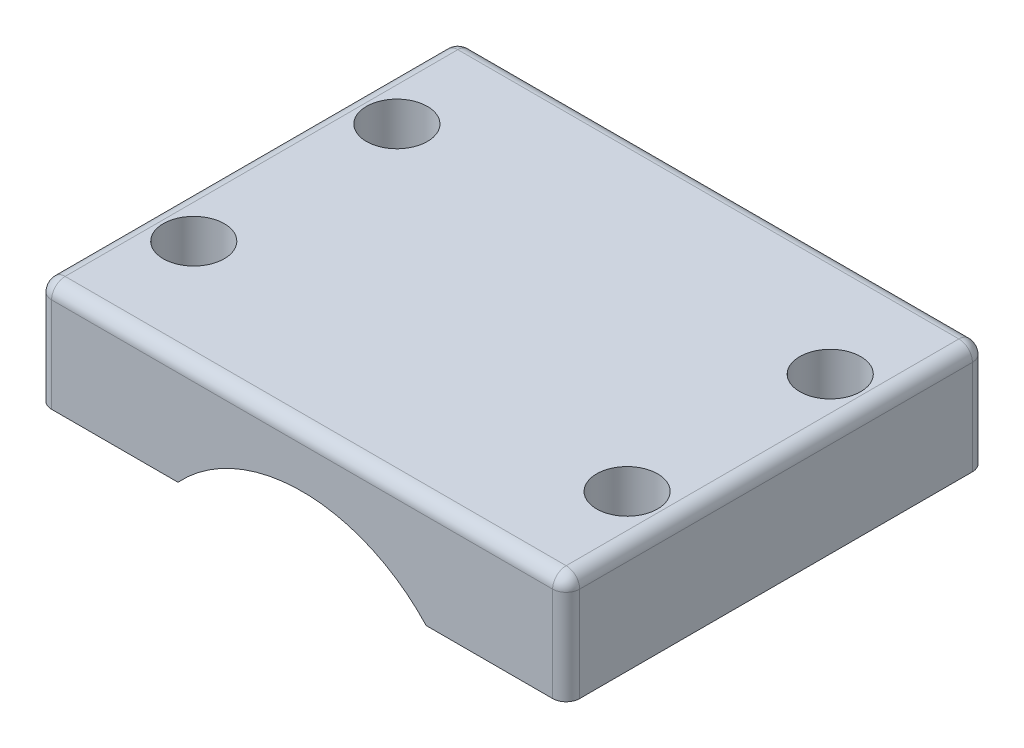
ISO-10303-21;
HEADER;
FILE_DESCRIPTION(('STEP AP214'),'2;1');
FILE_NAME('part.step','',(''),(''),'','','');
FILE_SCHEMA(('AUTOMOTIVE_DESIGN { 1 0 10303 214 1 1 1 1 }'));
ENDSEC;
DATA;
#1=APPLICATION_CONTEXT('core data for automotive mechanical design processes');
#2=APPLICATION_PROTOCOL_DEFINITION('international standard','automotive_design',2000,#1);
#3=PRODUCT_CONTEXT('',#1,'mechanical');
#4=PRODUCT('Part','Part','',(#3));
#5=PRODUCT_RELATED_PRODUCT_CATEGORY('part','',(#4));
#6=PRODUCT_DEFINITION_FORMATION('','',#4);
#7=PRODUCT_DEFINITION_CONTEXT('part definition',#1,'design');
#8=PRODUCT_DEFINITION('design','',#6,#7);
#9=PRODUCT_DEFINITION_SHAPE('','',#8);
#10=(LENGTH_UNIT() NAMED_UNIT(*) SI_UNIT(.MILLI.,.METRE.));
#11=(NAMED_UNIT(*) PLANE_ANGLE_UNIT() SI_UNIT($,.RADIAN.));
#12=(NAMED_UNIT(*) SI_UNIT($,.STERADIAN.) SOLID_ANGLE_UNIT());
#13=UNCERTAINTY_MEASURE_WITH_UNIT(LENGTH_MEASURE(1.E-05),#10,'distance_accuracy_value','');
#14=(GEOMETRIC_REPRESENTATION_CONTEXT(3) GLOBAL_UNCERTAINTY_ASSIGNED_CONTEXT((#13)) GLOBAL_UNIT_ASSIGNED_CONTEXT((#10,
#11,#12)) REPRESENTATION_CONTEXT('',''));
#15=CARTESIAN_POINT('',(0.,0.,0.));
#16=DIRECTION('',(0.,0.,1.));
#17=DIRECTION('',(1.,0.,0.));
#18=AXIS2_PLACEMENT_3D('',#15,#16,#17);
#19=CARTESIAN_POINT('',(0.,0.,0.));
#20=DIRECTION('',(0.,1.,0.));
#21=DIRECTION('',(0.,0.,1.));
#22=AXIS2_PLACEMENT_3D('',#19,#20,#21);
#23=PLANE('',#22);
#24=CARTESIAN_POINT('',(3.5,0.,-8.));
#25=DIRECTION('',(0.,1.,0.));
#26=DIRECTION('',(0.,0.,1.));
#27=AXIS2_PLACEMENT_3D('',#24,#25,#26);
#28=CIRCLE('',#27,2.25);
#29=CARTESIAN_POINT('',(3.5,0.,-5.75));
#30=VERTEX_POINT('',#29);
#31=EDGE_CURVE('E223',#30,#30,#28,.T.);
#32=ORIENTED_EDGE('',*,*,#31,.T.);
#33=EDGE_LOOP('',(#32));
#34=FACE_BOUND('',#33,.T.);
#35=CARTESIAN_POINT('',(3.5,0.,-23.));
#36=DIRECTION('',(0.,1.,0.));
#37=DIRECTION('',(0.,0.,-1.));
#38=AXIS2_PLACEMENT_3D('',#35,#36,#37);
#39=CIRCLE('',#38,2.25);
#40=CARTESIAN_POINT('',(3.5,0.,-25.25));
#41=VERTEX_POINT('',#40);
#42=EDGE_CURVE('E231',#41,#41,#39,.T.);
#43=ORIENTED_EDGE('',*,*,#42,.T.);
#44=EDGE_LOOP('',(#43));
#45=FACE_BOUND('',#44,.T.);
#46=DIRECTION('',(-1.,0.,0.));
#47=VECTOR('',#46,1.);
#48=CARTESIAN_POINT('',(0.,0.,-31.));
#49=LINE('',#48,#47);
#50=CARTESIAN_POINT('',(10.3348486100883,0.,-31.));
#51=VERTEX_POINT('',#50);
#52=CARTESIAN_POINT('',(1.,0.,-31.));
#53=VERTEX_POINT('',#52);
#54=EDGE_CURVE('E135',#51,#53,#49,.T.);
#55=ORIENTED_EDGE('',*,*,#54,.F.);
#56=DIRECTION('',(0.,0.,1.));
#57=VECTOR('',#56,1.);
#58=CARTESIAN_POINT('',(10.3348486100883,0.,-82.9230199429887));
#59=LINE('',#58,#57);
#60=CARTESIAN_POINT('',(10.3348486100883,0.,0.));
#61=VERTEX_POINT('',#60);
#62=EDGE_CURVE('E51',#51,#61,#59,.T.);
#63=ORIENTED_EDGE('',*,*,#62,.T.);
#64=DIRECTION('',(1.,0.,0.));
#65=VECTOR('',#64,1.);
#66=CARTESIAN_POINT('',(0.,0.,0.));
#67=LINE('',#66,#65);
#68=CARTESIAN_POINT('',(1.,0.,0.));
#69=VERTEX_POINT('',#68);
#70=EDGE_CURVE('E132',#69,#61,#67,.T.);
#71=ORIENTED_EDGE('',*,*,#70,.F.);
#72=CARTESIAN_POINT('',(1.,0.,-1.));
#73=DIRECTION('',(0.,1.,0.));
#74=DIRECTION('',(0.,0.,1.));
#75=AXIS2_PLACEMENT_3D('',#72,#73,#74);
#76=CIRCLE('',#75,1.);
#77=CARTESIAN_POINT('',(0.,0.,-1.));
#78=VERTEX_POINT('',#77);
#79=EDGE_CURVE('E11',#69,#78,#76,.F.);
#80=ORIENTED_EDGE('',*,*,#79,.T.);
#81=DIRECTION('',(0.,0.,1.));
#82=VECTOR('',#81,1.);
#83=CARTESIAN_POINT('',(0.,0.,-31.));
#84=LINE('',#83,#82);
#85=CARTESIAN_POINT('',(0.,0.,-30.));
#86=VERTEX_POINT('',#85);
#87=EDGE_CURVE('E144',#86,#78,#84,.T.);
#88=ORIENTED_EDGE('',*,*,#87,.F.);
#89=CARTESIAN_POINT('',(1.,0.,-30.));
#90=DIRECTION('',(0.,1.,0.));
#91=DIRECTION('',(0.,0.,1.));
#92=AXIS2_PLACEMENT_3D('',#89,#90,#91);
#93=CIRCLE('',#92,1.);
#94=EDGE_CURVE('E183',#86,#53,#93,.F.);
#95=ORIENTED_EDGE('',*,*,#94,.T.);
#96=EDGE_LOOP('',(#55,#63,#71,#80,#88,#95));
#97=FACE_BOUND('',#96,.T.);
#98=ADVANCED_FACE('F34',(#34,#45,#97),#23,.F.);
#99=CARTESIAN_POINT('',(0.,8.,0.));
#100=DIRECTION('',(0.,1.,0.));
#101=DIRECTION('',(0.,0.,1.));
#102=AXIS2_PLACEMENT_3D('',#99,#100,#101);
#103=PLANE('',#102);
#104=DIRECTION('',(0.,0.,-1.));
#105=VECTOR('',#104,1.);
#106=CARTESIAN_POINT('',(38.,8.,-31.));
#107=LINE('',#106,#105);
#108=CARTESIAN_POINT('',(38.,8.,-1.));
#109=VERTEX_POINT('',#108);
#110=CARTESIAN_POINT('',(38.,8.,-30.));
#111=VERTEX_POINT('',#110);
#112=EDGE_CURVE('E153',#109,#111,#107,.T.);
#113=ORIENTED_EDGE('',*,*,#112,.T.);
#114=DIRECTION('',(-1.,0.,0.));
#115=VECTOR('',#114,1.);
#116=CARTESIAN_POINT('',(0.,8.,-30.));
#117=LINE('',#116,#115);
#118=CARTESIAN_POINT('',(1.,8.,-30.));
#119=VERTEX_POINT('',#118);
#120=EDGE_CURVE('E157',#111,#119,#117,.T.);
#121=ORIENTED_EDGE('',*,*,#120,.T.);
#122=DIRECTION('',(0.,0.,1.));
#123=VECTOR('',#122,1.);
#124=CARTESIAN_POINT('',(1.,8.,0.));
#125=LINE('',#124,#123);
#126=CARTESIAN_POINT('',(1.,8.,-1.));
#127=VERTEX_POINT('',#126);
#128=EDGE_CURVE('E155',#119,#127,#125,.T.);
#129=ORIENTED_EDGE('',*,*,#128,.T.);
#130=DIRECTION('',(1.,0.,0.));
#131=VECTOR('',#130,1.);
#132=CARTESIAN_POINT('',(39.,8.,-1.));
#133=LINE('',#132,#131);
#134=EDGE_CURVE('E151',#127,#109,#133,.T.);
#135=ORIENTED_EDGE('',*,*,#134,.T.);
#136=EDGE_LOOP('',(#113,#121,#129,#135));
#137=FACE_BOUND('',#136,.T.);
#138=CARTESIAN_POINT('',(3.5,8.,-23.));
#139=DIRECTION('',(0.,1.,0.));
#140=DIRECTION('',(0.,0.,-1.));
#141=AXIS2_PLACEMENT_3D('',#138,#139,#140);
#142=CIRCLE('',#141,2.25);
#143=CARTESIAN_POINT('',(3.5,8.,-25.25));
#144=VERTEX_POINT('',#143);
#145=EDGE_CURVE('E234',#144,#144,#142,.T.);
#146=ORIENTED_EDGE('',*,*,#145,.F.);
#147=EDGE_LOOP('',(#146));
#148=FACE_BOUND('',#147,.T.);
#149=CARTESIAN_POINT('',(35.5,8.,-23.));
#150=DIRECTION('',(0.,1.,0.));
#151=DIRECTION('',(0.,0.,1.));
#152=AXIS2_PLACEMENT_3D('',#149,#150,#151);
#153=CIRCLE('',#152,2.25);
#154=CARTESIAN_POINT('',(35.5,8.,-20.75));
#155=VERTEX_POINT('',#154);
#156=EDGE_CURVE('E246',#155,#155,#153,.T.);
#157=ORIENTED_EDGE('',*,*,#156,.F.);
#158=EDGE_LOOP('',(#157));
#159=FACE_BOUND('',#158,.T.);
#160=CARTESIAN_POINT('',(35.5,8.,-8.));
#161=DIRECTION('',(0.,1.,0.));
#162=DIRECTION('',(0.,0.,-1.));
#163=AXIS2_PLACEMENT_3D('',#160,#161,#162);
#164=CIRCLE('',#163,2.25);
#165=CARTESIAN_POINT('',(35.5,8.,-10.25));
#166=VERTEX_POINT('',#165);
#167=EDGE_CURVE('E240',#166,#166,#164,.T.);
#168=ORIENTED_EDGE('',*,*,#167,.F.);
#169=EDGE_LOOP('',(#168));
#170=FACE_BOUND('',#169,.T.);
#171=CARTESIAN_POINT('',(3.5,8.,-8.));
#172=DIRECTION('',(0.,1.,0.));
#173=DIRECTION('',(0.,0.,1.));
#174=AXIS2_PLACEMENT_3D('',#171,#172,#173);
#175=CIRCLE('',#174,2.25);
#176=CARTESIAN_POINT('',(3.5,8.,-5.75));
#177=VERTEX_POINT('',#176);
#178=EDGE_CURVE('E226',#177,#177,#175,.T.);
#179=ORIENTED_EDGE('',*,*,#178,.F.);
#180=EDGE_LOOP('',(#179));
#181=FACE_BOUND('',#180,.T.);
#182=ADVANCED_FACE('F272',(#137,#148,#159,#170,#181),#103,.T.);
#183=CARTESIAN_POINT('',(28.6651513899117,0.,0.));
#184=VERTEX_POINT('',#183);
#185=CARTESIAN_POINT('',(38.,0.,0.));
#186=VERTEX_POINT('',#185);
#187=EDGE_CURVE('E140',#184,#186,#67,.T.);
#188=ORIENTED_EDGE('',*,*,#187,.F.);
#189=DIRECTION('',(0.,0.,1.));
#190=VECTOR('',#189,1.);
#191=CARTESIAN_POINT('',(28.6651513899117,0.,-82.9230199429887));
#192=LINE('',#191,#190);
#193=CARTESIAN_POINT('',(28.6651513899117,0.,-31.));
#194=VERTEX_POINT('',#193);
#195=EDGE_CURVE('E125',#194,#184,#192,.T.);
#196=ORIENTED_EDGE('',*,*,#195,.F.);
#197=CARTESIAN_POINT('',(38.,0.,-31.));
#198=VERTEX_POINT('',#197);
#199=EDGE_CURVE('E148',#198,#194,#49,.T.);
#200=ORIENTED_EDGE('',*,*,#199,.F.);
#201=CARTESIAN_POINT('',(38.,0.,-30.));
#202=DIRECTION('',(0.,1.,0.));
#203=DIRECTION('',(0.,0.,1.));
#204=AXIS2_PLACEMENT_3D('',#201,#202,#203);
#205=CIRCLE('',#204,1.);
#206=CARTESIAN_POINT('',(39.,0.,-30.));
#207=VERTEX_POINT('',#206);
#208=EDGE_CURVE('E185',#198,#207,#205,.F.);
#209=ORIENTED_EDGE('',*,*,#208,.T.);
#210=DIRECTION('',(0.,0.,-1.));
#211=VECTOR('',#210,1.);
#212=CARTESIAN_POINT('',(39.,0.,-31.));
#213=LINE('',#212,#211);
#214=CARTESIAN_POINT('',(39.,0.,-1.));
#215=VERTEX_POINT('',#214);
#216=EDGE_CURVE('E139',#215,#207,#213,.T.);
#217=ORIENTED_EDGE('',*,*,#216,.F.);
#218=CARTESIAN_POINT('',(38.,0.,-1.));
#219=DIRECTION('',(0.,1.,0.));
#220=DIRECTION('',(0.,0.,1.));
#221=AXIS2_PLACEMENT_3D('',#218,#219,#220);
#222=CIRCLE('',#221,1.);
#223=EDGE_CURVE('E43',#215,#186,#222,.F.);
#224=ORIENTED_EDGE('',*,*,#223,.T.);
#225=EDGE_LOOP('',(#188,#196,#200,#209,#217,#224));
#226=FACE_BOUND('',#225,.T.);
#227=CARTESIAN_POINT('',(35.5,0.,-23.));
#228=DIRECTION('',(0.,1.,0.));
#229=DIRECTION('',(0.,0.,1.));
#230=AXIS2_PLACEMENT_3D('',#227,#228,#229);
#231=CIRCLE('',#230,2.25);
#232=CARTESIAN_POINT('',(35.5,0.,-20.75));
#233=VERTEX_POINT('',#232);
#234=EDGE_CURVE('E243',#233,#233,#231,.T.);
#235=ORIENTED_EDGE('',*,*,#234,.T.);
#236=EDGE_LOOP('',(#235));
#237=FACE_BOUND('',#236,.T.);
#238=CARTESIAN_POINT('',(35.5,0.,-8.));
#239=DIRECTION('',(0.,1.,0.));
#240=DIRECTION('',(0.,0.,-1.));
#241=AXIS2_PLACEMENT_3D('',#238,#239,#240);
#242=CIRCLE('',#241,2.25);
#243=CARTESIAN_POINT('',(35.5,0.,-10.25));
#244=VERTEX_POINT('',#243);
#245=EDGE_CURVE('E237',#244,#244,#242,.T.);
#246=ORIENTED_EDGE('',*,*,#245,.T.);
#247=EDGE_LOOP('',(#246));
#248=FACE_BOUND('',#247,.T.);
#249=ADVANCED_FACE('F251',(#226,#237,#248),#23,.F.);
#250=CARTESIAN_POINT('',(0.,8.,-31.));
#251=DIRECTION('',(1.,0.,0.));
#252=DIRECTION('',(0.,0.,-1.));
#253=AXIS2_PLACEMENT_3D('',#250,#251,#252);
#254=PLANE('',#253);
#255=ORIENTED_EDGE('',*,*,#87,.T.);
#256=DIRECTION('',(0.,-1.,0.));
#257=VECTOR('',#256,1.);
#258=CARTESIAN_POINT('',(0.,8.,-1.));
#259=LINE('',#258,#257);
#260=CARTESIAN_POINT('',(0.,7.,-1.));
#261=VERTEX_POINT('',#260);
#262=EDGE_CURVE('E171',#78,#261,#259,.F.);
#263=ORIENTED_EDGE('',*,*,#262,.T.);
#264=DIRECTION('',(0.,0.,1.));
#265=VECTOR('',#264,1.);
#266=CARTESIAN_POINT('',(0.,7.,-31.));
#267=LINE('',#266,#265);
#268=CARTESIAN_POINT('',(0.,7.,-30.));
#269=VERTEX_POINT('',#268);
#270=EDGE_CURVE('E169',#261,#269,#267,.F.);
#271=ORIENTED_EDGE('',*,*,#270,.T.);
#272=DIRECTION('',(0.,-1.,0.));
#273=VECTOR('',#272,1.);
#274=CARTESIAN_POINT('',(0.,8.,-30.));
#275=LINE('',#274,#273);
#276=EDGE_CURVE('E167',#269,#86,#275,.T.);
#277=ORIENTED_EDGE('',*,*,#276,.T.);
#278=EDGE_LOOP('',(#255,#263,#271,#277));
#279=FACE_BOUND('',#278,.T.);
#280=ADVANCED_FACE('F280',(#279),#254,.F.);
#281=CARTESIAN_POINT('',(0.,8.,0.));
#282=DIRECTION('',(0.,0.,-1.));
#283=DIRECTION('',(-1.,0.,0.));
#284=AXIS2_PLACEMENT_3D('',#281,#282,#283);
#285=PLANE('',#284);
#286=ORIENTED_EDGE('',*,*,#70,.T.);
#287=CARTESIAN_POINT('',(19.5,-8.5,0.));
#288=DIRECTION('',(0.,0.,1.));
#289=DIRECTION('',(-1.,0.,0.));
#290=AXIS2_PLACEMENT_3D('',#287,#288,#289);
#291=CIRCLE('',#290,12.5);
#292=EDGE_CURVE('E122',#184,#61,#291,.T.);
#293=ORIENTED_EDGE('',*,*,#292,.F.);
#294=ORIENTED_EDGE('',*,*,#187,.T.);
#295=DIRECTION('',(0.,-1.,0.));
#296=VECTOR('',#295,1.);
#297=CARTESIAN_POINT('',(38.,8.,0.));
#298=LINE('',#297,#296);
#299=CARTESIAN_POINT('',(38.,7.,0.));
#300=VERTEX_POINT('',#299);
#301=EDGE_CURVE('E179',#186,#300,#298,.F.);
#302=ORIENTED_EDGE('',*,*,#301,.T.);
#303=DIRECTION('',(1.,0.,0.));
#304=VECTOR('',#303,1.);
#305=CARTESIAN_POINT('',(0.,7.,0.));
#306=LINE('',#305,#304);
#307=CARTESIAN_POINT('',(1.,7.,0.));
#308=VERTEX_POINT('',#307);
#309=EDGE_CURVE('E59',#300,#308,#306,.F.);
#310=ORIENTED_EDGE('',*,*,#309,.T.);
#311=DIRECTION('',(0.,-1.,0.));
#312=VECTOR('',#311,1.);
#313=CARTESIAN_POINT('',(1.,8.,0.));
#314=LINE('',#313,#312);
#315=EDGE_CURVE('E138',#308,#69,#314,.T.);
#316=ORIENTED_EDGE('',*,*,#315,.T.);
#317=EDGE_LOOP('',(#286,#293,#294,#302,#310,#316));
#318=FACE_BOUND('',#317,.T.);
#319=ADVANCED_FACE('F137',(#318),#285,.F.);
#320=CARTESIAN_POINT('',(39.,8.,-31.));
#321=DIRECTION('',(-1.,0.,0.));
#322=DIRECTION('',(0.,0.,1.));
#323=AXIS2_PLACEMENT_3D('',#320,#321,#322);
#324=PLANE('',#323);
#325=DIRECTION('',(0.,0.,-1.));
#326=VECTOR('',#325,1.);
#327=CARTESIAN_POINT('',(39.,7.,0.));
#328=LINE('',#327,#326);
#329=CARTESIAN_POINT('',(39.,7.,-30.));
#330=VERTEX_POINT('',#329);
#331=CARTESIAN_POINT('',(39.,7.,-1.));
#332=VERTEX_POINT('',#331);
#333=EDGE_CURVE('E175',#330,#332,#328,.F.);
#334=ORIENTED_EDGE('',*,*,#333,.T.);
#335=DIRECTION('',(0.,-1.,0.));
#336=VECTOR('',#335,1.);
#337=CARTESIAN_POINT('',(39.,8.,-1.));
#338=LINE('',#337,#336);
#339=EDGE_CURVE('E177',#332,#215,#338,.T.);
#340=ORIENTED_EDGE('',*,*,#339,.T.);
#341=ORIENTED_EDGE('',*,*,#216,.T.);
#342=DIRECTION('',(0.,-1.,0.));
#343=VECTOR('',#342,1.);
#344=CARTESIAN_POINT('',(39.,8.,-30.));
#345=LINE('',#344,#343);
#346=EDGE_CURVE('E173',#207,#330,#345,.F.);
#347=ORIENTED_EDGE('',*,*,#346,.T.);
#348=EDGE_LOOP('',(#334,#340,#341,#347));
#349=FACE_BOUND('',#348,.T.);
#350=ADVANCED_FACE('F267',(#349),#324,.F.);
#351=CARTESIAN_POINT('',(0.,8.,-31.));
#352=DIRECTION('',(0.,0.,1.));
#353=DIRECTION('',(1.,0.,0.));
#354=AXIS2_PLACEMENT_3D('',#351,#352,#353);
#355=PLANE('',#354);
#356=ORIENTED_EDGE('',*,*,#199,.T.);
#357=CARTESIAN_POINT('',(19.5,-8.5,-31.));
#358=DIRECTION('',(0.,0.,1.));
#359=DIRECTION('',(1.,0.,0.));
#360=AXIS2_PLACEMENT_3D('',#357,#358,#359);
#361=CIRCLE('',#360,12.5);
#362=EDGE_CURVE('E192',#51,#194,#361,.F.);
#363=ORIENTED_EDGE('',*,*,#362,.F.);
#364=ORIENTED_EDGE('',*,*,#54,.T.);
#365=DIRECTION('',(0.,-1.,0.));
#366=VECTOR('',#365,1.);
#367=CARTESIAN_POINT('',(1.,8.,-31.));
#368=LINE('',#367,#366);
#369=CARTESIAN_POINT('',(1.,7.,-31.));
#370=VERTEX_POINT('',#369);
#371=EDGE_CURVE('E160',#53,#370,#368,.F.);
#372=ORIENTED_EDGE('',*,*,#371,.T.);
#373=DIRECTION('',(-1.,0.,0.));
#374=VECTOR('',#373,1.);
#375=CARTESIAN_POINT('',(39.,7.,-31.));
#376=LINE('',#375,#374);
#377=CARTESIAN_POINT('',(38.,7.,-31.));
#378=VERTEX_POINT('',#377);
#379=EDGE_CURVE('E162',#370,#378,#376,.F.);
#380=ORIENTED_EDGE('',*,*,#379,.T.);
#381=DIRECTION('',(0.,-1.,0.));
#382=VECTOR('',#381,1.);
#383=CARTESIAN_POINT('',(38.,8.,-31.));
#384=LINE('',#383,#382);
#385=EDGE_CURVE('E165',#378,#198,#384,.T.);
#386=ORIENTED_EDGE('',*,*,#385,.T.);
#387=EDGE_LOOP('',(#356,#363,#364,#372,#380,#386));
#388=FACE_BOUND('',#387,.T.);
#389=ADVANCED_FACE('F257',(#388),#355,.F.);
#390=CARTESIAN_POINT('',(35.5,8.,-23.));
#391=DIRECTION('',(0.,-1.,0.));
#392=DIRECTION('',(0.,0.,-1.));
#393=AXIS2_PLACEMENT_3D('',#390,#391,#392);
#394=CYLINDRICAL_SURFACE('',#393,2.25);
#395=ORIENTED_EDGE('',*,*,#156,.T.);
#396=EDGE_LOOP('',(#395));
#397=FACE_BOUND('',#396,.T.);
#398=ORIENTED_EDGE('',*,*,#234,.F.);
#399=EDGE_LOOP('',(#398));
#400=FACE_BOUND('',#399,.T.);
#401=ADVANCED_FACE('F254',(#397,#400),#394,.F.);
#402=CARTESIAN_POINT('',(35.5,8.,-8.));
#403=DIRECTION('',(0.,-1.,0.));
#404=DIRECTION('',(0.,0.,-1.));
#405=AXIS2_PLACEMENT_3D('',#402,#403,#404);
#406=CYLINDRICAL_SURFACE('',#405,2.25);
#407=ORIENTED_EDGE('',*,*,#167,.T.);
#408=EDGE_LOOP('',(#407));
#409=FACE_BOUND('',#408,.T.);
#410=ORIENTED_EDGE('',*,*,#245,.F.);
#411=EDGE_LOOP('',(#410));
#412=FACE_BOUND('',#411,.T.);
#413=ADVANCED_FACE('F256',(#409,#412),#406,.F.);
#414=CARTESIAN_POINT('',(3.5,8.,-23.));
#415=DIRECTION('',(0.,-1.,0.));
#416=DIRECTION('',(0.,0.,-1.));
#417=AXIS2_PLACEMENT_3D('',#414,#415,#416);
#418=CYLINDRICAL_SURFACE('',#417,2.25);
#419=ORIENTED_EDGE('',*,*,#145,.T.);
#420=EDGE_LOOP('',(#419));
#421=FACE_BOUND('',#420,.T.);
#422=ORIENTED_EDGE('',*,*,#42,.F.);
#423=EDGE_LOOP('',(#422));
#424=FACE_BOUND('',#423,.T.);
#425=ADVANCED_FACE('F264',(#421,#424),#418,.F.);
#426=CARTESIAN_POINT('',(3.5,8.,-8.));
#427=DIRECTION('',(0.,-1.,0.));
#428=DIRECTION('',(0.,0.,-1.));
#429=AXIS2_PLACEMENT_3D('',#426,#427,#428);
#430=CYLINDRICAL_SURFACE('',#429,2.25);
#431=ORIENTED_EDGE('',*,*,#178,.T.);
#432=EDGE_LOOP('',(#431));
#433=FACE_BOUND('',#432,.T.);
#434=ORIENTED_EDGE('',*,*,#31,.F.);
#435=EDGE_LOOP('',(#434));
#436=FACE_BOUND('',#435,.T.);
#437=ADVANCED_FACE('F328',(#433,#436),#430,.F.);
#438=CARTESIAN_POINT('',(38.,8.,-1.));
#439=DIRECTION('',(0.,-1.,0.));
#440=DIRECTION('',(0.,0.,-1.));
#441=AXIS2_PLACEMENT_3D('',#438,#439,#440);
#442=CYLINDRICAL_SURFACE('',#441,1.);
#443=ORIENTED_EDGE('',*,*,#223,.F.);
#444=ORIENTED_EDGE('',*,*,#339,.F.);
#445=CARTESIAN_POINT('',(38.,7.,-1.));
#446=DIRECTION('',(0.,1.,0.));
#447=DIRECTION('',(0.,0.,1.));
#448=AXIS2_PLACEMENT_3D('',#445,#446,#447);
#449=CIRCLE('',#448,1.);
#450=EDGE_CURVE('E38',#300,#332,#449,.T.);
#451=ORIENTED_EDGE('',*,*,#450,.F.);
#452=ORIENTED_EDGE('',*,*,#301,.F.);
#453=EDGE_LOOP('',(#443,#444,#451,#452));
#454=FACE_BOUND('',#453,.T.);
#455=ADVANCED_FACE('F36',(#454),#442,.T.);
#456=CARTESIAN_POINT('',(0.,7.,-1.));
#457=DIRECTION('',(-1.,0.,0.));
#458=DIRECTION('',(0.,0.,1.));
#459=AXIS2_PLACEMENT_3D('',#456,#457,#458);
#460=CYLINDRICAL_SURFACE('',#459,1.);
#461=CARTESIAN_POINT('',(1.,7.,-1.));
#462=DIRECTION('',(-1.,0.,0.));
#463=DIRECTION('',(0.,-1.,0.));
#464=AXIS2_PLACEMENT_3D('',#461,#462,#463);
#465=CIRCLE('',#464,1.);
#466=EDGE_CURVE('E215',#308,#127,#465,.T.);
#467=ORIENTED_EDGE('',*,*,#466,.F.);
#468=ORIENTED_EDGE('',*,*,#309,.F.);
#469=CARTESIAN_POINT('',(38.,7.,-1.));
#470=DIRECTION('',(1.,0.,0.));
#471=DIRECTION('',(0.,0.,-1.));
#472=AXIS2_PLACEMENT_3D('',#469,#470,#471);
#473=CIRCLE('',#472,1.);
#474=EDGE_CURVE('E217',#109,#300,#473,.T.);
#475=ORIENTED_EDGE('',*,*,#474,.F.);
#476=ORIENTED_EDGE('',*,*,#134,.F.);
#477=EDGE_LOOP('',(#467,#468,#475,#476));
#478=FACE_BOUND('',#477,.T.);
#479=ADVANCED_FACE('F294',(#478),#460,.T.);
#480=CARTESIAN_POINT('',(1.,8.,-1.));
#481=DIRECTION('',(0.,-1.,0.));
#482=DIRECTION('',(0.,0.,-1.));
#483=AXIS2_PLACEMENT_3D('',#480,#481,#482);
#484=CYLINDRICAL_SURFACE('',#483,1.);
#485=ORIENTED_EDGE('',*,*,#79,.F.);
#486=ORIENTED_EDGE('',*,*,#315,.F.);
#487=CARTESIAN_POINT('',(1.,7.,-1.));
#488=DIRECTION('',(0.,1.,0.));
#489=DIRECTION('',(0.,0.,1.));
#490=AXIS2_PLACEMENT_3D('',#487,#488,#489);
#491=CIRCLE('',#490,1.);
#492=EDGE_CURVE('E212',#261,#308,#491,.T.);
#493=ORIENTED_EDGE('',*,*,#492,.F.);
#494=ORIENTED_EDGE('',*,*,#262,.F.);
#495=EDGE_LOOP('',(#485,#486,#493,#494));
#496=FACE_BOUND('',#495,.T.);
#497=ADVANCED_FACE('F313',(#496),#484,.T.);
#498=CARTESIAN_POINT('',(38.,7.,-1.));
#499=DIRECTION('',(0.,0.,1.));
#500=DIRECTION('',(1.,0.,0.));
#501=AXIS2_PLACEMENT_3D('',#498,#499,#500);
#502=SPHERICAL_SURFACE('',#501,1.);
#503=ORIENTED_EDGE('',*,*,#474,.T.);
#504=ORIENTED_EDGE('',*,*,#450,.T.);
#505=CARTESIAN_POINT('',(38.,7.,-1.));
#506=DIRECTION('',(0.,0.,1.));
#507=DIRECTION('',(0.,-1.,0.));
#508=AXIS2_PLACEMENT_3D('',#505,#506,#507);
#509=CIRCLE('',#508,1.);
#510=EDGE_CURVE('E209',#109,#332,#509,.F.);
#511=ORIENTED_EDGE('',*,*,#510,.F.);
#512=EDGE_LOOP('',(#503,#504,#511));
#513=FACE_BOUND('',#512,.T.);
#514=ADVANCED_FACE('F310',(#513),#502,.T.);
#515=CARTESIAN_POINT('',(1.,7.,-1.));
#516=DIRECTION('',(0.,0.,1.));
#517=DIRECTION('',(1.,0.,0.));
#518=AXIS2_PLACEMENT_3D('',#515,#516,#517);
#519=SPHERICAL_SURFACE('',#518,1.);
#520=ORIENTED_EDGE('',*,*,#492,.T.);
#521=ORIENTED_EDGE('',*,*,#466,.T.);
#522=CARTESIAN_POINT('',(1.,7.,-1.));
#523=DIRECTION('',(0.,0.,1.));
#524=DIRECTION('',(1.,0.,0.));
#525=AXIS2_PLACEMENT_3D('',#522,#523,#524);
#526=CIRCLE('',#525,1.);
#527=EDGE_CURVE('E206',#261,#127,#526,.F.);
#528=ORIENTED_EDGE('',*,*,#527,.F.);
#529=EDGE_LOOP('',(#520,#521,#528));
#530=FACE_BOUND('',#529,.T.);
#531=ADVANCED_FACE('F312',(#530),#519,.T.);
#532=CARTESIAN_POINT('',(38.,8.,-30.));
#533=DIRECTION('',(0.,-1.,0.));
#534=DIRECTION('',(0.,0.,-1.));
#535=AXIS2_PLACEMENT_3D('',#532,#533,#534);
#536=CYLINDRICAL_SURFACE('',#535,1.);
#537=ORIENTED_EDGE('',*,*,#208,.F.);
#538=ORIENTED_EDGE('',*,*,#385,.F.);
#539=CARTESIAN_POINT('',(38.,7.,-30.));
#540=DIRECTION('',(0.,1.,0.));
#541=DIRECTION('',(0.,0.,1.));
#542=AXIS2_PLACEMENT_3D('',#539,#540,#541);
#543=CIRCLE('',#542,1.);
#544=EDGE_CURVE('E203',#330,#378,#543,.T.);
#545=ORIENTED_EDGE('',*,*,#544,.F.);
#546=ORIENTED_EDGE('',*,*,#346,.F.);
#547=EDGE_LOOP('',(#537,#538,#545,#546));
#548=FACE_BOUND('',#547,.T.);
#549=ADVANCED_FACE('F303',(#548),#536,.T.);
#550=CARTESIAN_POINT('',(38.,7.,0.));
#551=DIRECTION('',(0.,0.,1.));
#552=DIRECTION('',(1.,0.,0.));
#553=AXIS2_PLACEMENT_3D('',#550,#551,#552);
#554=CYLINDRICAL_SURFACE('',#553,1.);
#555=ORIENTED_EDGE('',*,*,#510,.T.);
#556=ORIENTED_EDGE('',*,*,#333,.F.);
#557=CARTESIAN_POINT('',(38.,7.,-30.));
#558=DIRECTION('',(0.,0.,-1.));
#559=DIRECTION('',(-1.,0.,0.));
#560=AXIS2_PLACEMENT_3D('',#557,#558,#559);
#561=CIRCLE('',#560,1.);
#562=EDGE_CURVE('E200',#111,#330,#561,.T.);
#563=ORIENTED_EDGE('',*,*,#562,.F.);
#564=ORIENTED_EDGE('',*,*,#112,.F.);
#565=EDGE_LOOP('',(#555,#556,#563,#564));
#566=FACE_BOUND('',#565,.T.);
#567=ADVANCED_FACE('F307',(#566),#554,.T.);
#568=CARTESIAN_POINT('',(1.,7.,0.));
#569=DIRECTION('',(0.,0.,-1.));
#570=DIRECTION('',(-1.,0.,0.));
#571=AXIS2_PLACEMENT_3D('',#568,#569,#570);
#572=CYLINDRICAL_SURFACE('',#571,1.);
#573=ORIENTED_EDGE('',*,*,#527,.T.);
#574=ORIENTED_EDGE('',*,*,#128,.F.);
#575=CARTESIAN_POINT('',(1.,7.,-30.));
#576=DIRECTION('',(0.,0.,-1.));
#577=DIRECTION('',(-1.,0.,0.));
#578=AXIS2_PLACEMENT_3D('',#575,#576,#577);
#579=CIRCLE('',#578,1.);
#580=EDGE_CURVE('E197',#269,#119,#579,.T.);
#581=ORIENTED_EDGE('',*,*,#580,.F.);
#582=ORIENTED_EDGE('',*,*,#270,.F.);
#583=EDGE_LOOP('',(#573,#574,#581,#582));
#584=FACE_BOUND('',#583,.T.);
#585=ADVANCED_FACE('F363',(#584),#572,.T.);
#586=CARTESIAN_POINT('',(1.,8.,-30.));
#587=DIRECTION('',(0.,-1.,0.));
#588=DIRECTION('',(0.,0.,-1.));
#589=AXIS2_PLACEMENT_3D('',#586,#587,#588);
#590=CYLINDRICAL_SURFACE('',#589,1.);
#591=ORIENTED_EDGE('',*,*,#94,.F.);
#592=ORIENTED_EDGE('',*,*,#276,.F.);
#593=CARTESIAN_POINT('',(1.,7.,-30.));
#594=DIRECTION('',(0.,1.,0.));
#595=DIRECTION('',(0.,0.,1.));
#596=AXIS2_PLACEMENT_3D('',#593,#594,#595);
#597=CIRCLE('',#596,1.);
#598=EDGE_CURVE('E194',#370,#269,#597,.T.);
#599=ORIENTED_EDGE('',*,*,#598,.F.);
#600=ORIENTED_EDGE('',*,*,#371,.F.);
#601=EDGE_LOOP('',(#591,#592,#599,#600));
#602=FACE_BOUND('',#601,.T.);
#603=ADVANCED_FACE('F359',(#602),#590,.T.);
#604=CARTESIAN_POINT('',(38.,7.,-30.));
#605=DIRECTION('',(0.,0.,1.));
#606=DIRECTION('',(1.,0.,0.));
#607=AXIS2_PLACEMENT_3D('',#604,#605,#606);
#608=SPHERICAL_SURFACE('',#607,1.);
#609=ORIENTED_EDGE('',*,*,#562,.T.);
#610=ORIENTED_EDGE('',*,*,#544,.T.);
#611=CARTESIAN_POINT('',(38.,7.,-30.));
#612=DIRECTION('',(1.,0.,0.));
#613=DIRECTION('',(0.,0.,-1.));
#614=AXIS2_PLACEMENT_3D('',#611,#612,#613);
#615=CIRCLE('',#614,1.);
#616=EDGE_CURVE('E191',#111,#378,#615,.F.);
#617=ORIENTED_EDGE('',*,*,#616,.F.);
#618=EDGE_LOOP('',(#609,#610,#617));
#619=FACE_BOUND('',#618,.T.);
#620=ADVANCED_FACE('F352',(#619),#608,.T.);
#621=CARTESIAN_POINT('',(1.,7.,-30.));
#622=DIRECTION('',(0.,0.,1.));
#623=DIRECTION('',(1.,0.,0.));
#624=AXIS2_PLACEMENT_3D('',#621,#622,#623);
#625=SPHERICAL_SURFACE('',#624,1.);
#626=ORIENTED_EDGE('',*,*,#598,.T.);
#627=ORIENTED_EDGE('',*,*,#580,.T.);
#628=CARTESIAN_POINT('',(1.,7.,-30.));
#629=DIRECTION('',(-1.,0.,0.));
#630=DIRECTION('',(0.,0.,1.));
#631=AXIS2_PLACEMENT_3D('',#628,#629,#630);
#632=CIRCLE('',#631,1.);
#633=EDGE_CURVE('E189',#370,#119,#632,.F.);
#634=ORIENTED_EDGE('',*,*,#633,.F.);
#635=EDGE_LOOP('',(#626,#627,#634));
#636=FACE_BOUND('',#635,.T.);
#637=ADVANCED_FACE('F346',(#636),#625,.T.);
#638=CARTESIAN_POINT('',(0.,7.,-30.));
#639=DIRECTION('',(1.,0.,0.));
#640=DIRECTION('',(0.,0.,-1.));
#641=AXIS2_PLACEMENT_3D('',#638,#639,#640);
#642=CYLINDRICAL_SURFACE('',#641,1.);
#643=ORIENTED_EDGE('',*,*,#616,.T.);
#644=ORIENTED_EDGE('',*,*,#379,.F.);
#645=ORIENTED_EDGE('',*,*,#633,.T.);
#646=ORIENTED_EDGE('',*,*,#120,.F.);
#647=EDGE_LOOP('',(#643,#644,#645,#646));
#648=FACE_BOUND('',#647,.T.);
#649=ADVANCED_FACE('F342',(#648),#642,.T.);
#650=CARTESIAN_POINT('',(19.5,-8.5,-82.9230199429887));
#651=DIRECTION('',(0.,0.,1.));
#652=DIRECTION('',(1.,0.,0.));
#653=AXIS2_PLACEMENT_3D('',#650,#651,#652);
#654=CYLINDRICAL_SURFACE('',#653,12.5);
#655=ORIENTED_EDGE('',*,*,#362,.T.);
#656=ORIENTED_EDGE('',*,*,#195,.T.);
#657=ORIENTED_EDGE('',*,*,#292,.T.);
#658=ORIENTED_EDGE('',*,*,#62,.F.);
#659=EDGE_LOOP('',(#655,#656,#657,#658));
#660=FACE_BOUND('',#659,.T.);
#661=ADVANCED_FACE('F123',(#660),#654,.F.);
#662=CLOSED_SHELL('',(#98,#182,#249,#280,#319,#350,#389,#401,#413,#425,#437,#455,#479,#497,#514,
#531,#549,#567,#585,#603,#620,#637,#649,#661));
#663=MANIFOLD_SOLID_BREP('B2',#662);
#664=ADVANCED_BREP_SHAPE_REPRESENTATION('',(#18,#663),#14);
#665=SHAPE_DEFINITION_REPRESENTATION(#9,#664);
ENDSEC;
END-ISO-10303-21;
